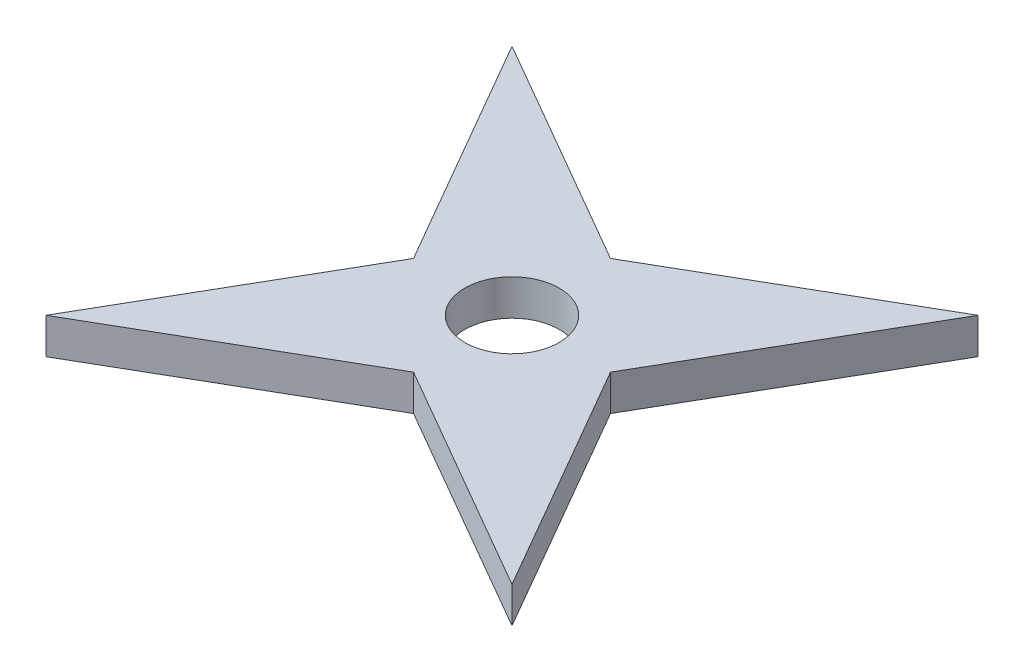
ISO-10303-21;
HEADER;
FILE_DESCRIPTION(('STEP AP214'),'2;1');
FILE_NAME('part.step','',(''),(''),'','','');
FILE_SCHEMA(('AUTOMOTIVE_DESIGN { 1 0 10303 214 1 1 1 1 }'));
ENDSEC;
DATA;
#1=APPLICATION_CONTEXT('core data for automotive mechanical design processes');
#2=APPLICATION_PROTOCOL_DEFINITION('international standard','automotive_design',2000,#1);
#3=PRODUCT_CONTEXT('',#1,'mechanical');
#4=PRODUCT('Part','Part','',(#3));
#5=PRODUCT_RELATED_PRODUCT_CATEGORY('part','',(#4));
#6=PRODUCT_DEFINITION_FORMATION('','',#4);
#7=PRODUCT_DEFINITION_CONTEXT('part definition',#1,'design');
#8=PRODUCT_DEFINITION('design','',#6,#7);
#9=PRODUCT_DEFINITION_SHAPE('','',#8);
#10=(LENGTH_UNIT() NAMED_UNIT(*) SI_UNIT(.MILLI.,.METRE.));
#11=(NAMED_UNIT(*) PLANE_ANGLE_UNIT() SI_UNIT($,.RADIAN.));
#12=(NAMED_UNIT(*) SI_UNIT($,.STERADIAN.) SOLID_ANGLE_UNIT());
#13=UNCERTAINTY_MEASURE_WITH_UNIT(LENGTH_MEASURE(1.E-05),#10,'distance_accuracy_value','');
#14=(GEOMETRIC_REPRESENTATION_CONTEXT(3) GLOBAL_UNCERTAINTY_ASSIGNED_CONTEXT((#13)) GLOBAL_UNIT_ASSIGNED_CONTEXT((#10,
#11,#12)) REPRESENTATION_CONTEXT('',''));
#15=CARTESIAN_POINT('',(0.,0.,0.));
#16=DIRECTION('',(0.,0.,1.));
#17=DIRECTION('',(1.,0.,0.));
#18=AXIS2_PLACEMENT_3D('',#15,#16,#17);
#19=CARTESIAN_POINT('',(0.,10.,0.));
#20=DIRECTION('',(0.,1.,0.));
#21=DIRECTION('',(0.,0.,1.));
#22=AXIS2_PLACEMENT_3D('',#19,#20,#21);
#23=PLANE('',#22);
#24=DIRECTION('',(0.866025403784438,0.,-0.500000000000001));
#25=VECTOR('',#24,1.);
#26=CARTESIAN_POINT('',(0.,10.,0.));
#27=LINE('',#26,#25);
#28=CARTESIAN_POINT('',(0.,10.,0.));
#29=VERTEX_POINT('',#28);
#30=CARTESIAN_POINT('',(64.9519052838328,10.,-37.5000000000001));
#31=VERTEX_POINT('',#30);
#32=EDGE_CURVE('E149',#29,#31,#27,.T.);
#33=ORIENTED_EDGE('',*,*,#32,.T.);
#34=DIRECTION('',(0.866025403784438,0.,0.500000000000001));
#35=VECTOR('',#34,1.);
#36=CARTESIAN_POINT('',(129.903810567666,10.,0.));
#37=LINE('',#36,#35);
#38=CARTESIAN_POINT('',(129.903810567666,10.,0.));
#39=VERTEX_POINT('',#38);
#40=EDGE_CURVE('E97',#31,#39,#37,.T.);
#41=ORIENTED_EDGE('',*,*,#40,.T.);
#42=DIRECTION('',(-0.500000000000001,0.,-0.866025403784438));
#43=VECTOR('',#42,1.);
#44=CARTESIAN_POINT('',(129.903810567666,10.,0.));
#45=LINE('',#44,#43);
#46=CARTESIAN_POINT('',(92.4038105676656,10.,-64.9519052838328));
#47=VERTEX_POINT('',#46);
#48=EDGE_CURVE('E164',#39,#47,#45,.T.);
#49=ORIENTED_EDGE('',*,*,#48,.T.);
#50=DIRECTION('',(0.5,0.,-0.866025403784438));
#51=VECTOR('',#50,1.);
#52=CARTESIAN_POINT('',(129.903810567666,10.,-129.903810567666));
#53=LINE('',#52,#51);
#54=CARTESIAN_POINT('',(129.903810567666,10.,-129.903810567666));
#55=VERTEX_POINT('',#54);
#56=EDGE_CURVE('E177',#47,#55,#53,.T.);
#57=ORIENTED_EDGE('',*,*,#56,.T.);
#58=DIRECTION('',(-0.866025403784438,0.,0.500000000000001));
#59=VECTOR('',#58,1.);
#60=CARTESIAN_POINT('',(129.903810567666,10.,-129.903810567666));
#61=LINE('',#60,#59);
#62=CARTESIAN_POINT('',(64.9519052838328,10.,-92.4038105676656));
#63=VERTEX_POINT('',#62);
#64=EDGE_CURVE('E116',#55,#63,#61,.T.);
#65=ORIENTED_EDGE('',*,*,#64,.T.);
#66=DIRECTION('',(-0.866025403784438,0.,-0.500000000000001));
#67=VECTOR('',#66,1.);
#68=CARTESIAN_POINT('',(0.,10.,-129.903810567666));
#69=LINE('',#68,#67);
#70=CARTESIAN_POINT('',(0.,10.,-129.903810567666));
#71=VERTEX_POINT('',#70);
#72=EDGE_CURVE('E110',#63,#71,#69,.T.);
#73=ORIENTED_EDGE('',*,*,#72,.T.);
#74=DIRECTION('',(0.500000000000001,0.,0.866025403784438));
#75=VECTOR('',#74,1.);
#76=CARTESIAN_POINT('',(0.,10.,-129.903810567666));
#77=LINE('',#76,#75);
#78=CARTESIAN_POINT('',(37.5000000000001,10.,-64.9519052838328));
#79=VERTEX_POINT('',#78);
#80=EDGE_CURVE('E114',#71,#79,#77,.T.);
#81=ORIENTED_EDGE('',*,*,#80,.T.);
#82=DIRECTION('',(-0.500000000000001,0.,0.866025403784438));
#83=VECTOR('',#82,1.);
#84=CARTESIAN_POINT('',(0.,10.,0.));
#85=LINE('',#84,#83);
#86=EDGE_CURVE('E54',#79,#29,#85,.T.);
#87=ORIENTED_EDGE('',*,*,#86,.T.);
#88=EDGE_LOOP('',(#33,#41,#49,#57,#65,#73,#81,#87));
#89=FACE_BOUND('',#88,.T.);
#90=CARTESIAN_POINT('',(64.9519052838328,10.,-64.9519052838328));
#91=DIRECTION('',(0.,1.,0.));
#92=DIRECTION('',(0.,0.,1.));
#93=AXIS2_PLACEMENT_3D('',#90,#91,#92);
#94=CIRCLE('',#93,13.155);
#95=CARTESIAN_POINT('',(64.9519052838328,10.,-51.7969052838328));
#96=VERTEX_POINT('',#95);
#97=EDGE_CURVE('E138',#96,#96,#94,.T.);
#98=ORIENTED_EDGE('',*,*,#97,.F.);
#99=EDGE_LOOP('',(#98));
#100=FACE_BOUND('',#99,.T.);
#101=ADVANCED_FACE('F37',(#89,#100),#23,.T.);
#102=CARTESIAN_POINT('',(0.,0.,0.));
#103=DIRECTION('',(0.,1.,0.));
#104=DIRECTION('',(0.,0.,1.));
#105=AXIS2_PLACEMENT_3D('',#102,#103,#104);
#106=PLANE('',#105);
#107=DIRECTION('',(0.866025403784438,0.,-0.500000000000001));
#108=VECTOR('',#107,1.);
#109=CARTESIAN_POINT('',(0.,0.,0.));
#110=LINE('',#109,#108);
#111=CARTESIAN_POINT('',(0.,0.,0.));
#112=VERTEX_POINT('',#111);
#113=CARTESIAN_POINT('',(64.9519052838328,0.,-37.5000000000001));
#114=VERTEX_POINT('',#113);
#115=EDGE_CURVE('E134',#112,#114,#110,.T.);
#116=ORIENTED_EDGE('',*,*,#115,.F.);
#117=DIRECTION('',(-0.500000000000001,0.,0.866025403784438));
#118=VECTOR('',#117,1.);
#119=CARTESIAN_POINT('',(0.,0.,0.));
#120=LINE('',#119,#118);
#121=CARTESIAN_POINT('',(37.5000000000001,0.,-64.9519052838328));
#122=VERTEX_POINT('',#121);
#123=EDGE_CURVE('E89',#122,#112,#120,.T.);
#124=ORIENTED_EDGE('',*,*,#123,.F.);
#125=DIRECTION('',(0.500000000000001,0.,0.866025403784438));
#126=VECTOR('',#125,1.);
#127=CARTESIAN_POINT('',(0.,0.,-129.903810567666));
#128=LINE('',#127,#126);
#129=CARTESIAN_POINT('',(0.,0.,-129.903810567666));
#130=VERTEX_POINT('',#129);
#131=EDGE_CURVE('E83',#130,#122,#128,.T.);
#132=ORIENTED_EDGE('',*,*,#131,.F.);
#133=DIRECTION('',(-0.866025403784438,0.,-0.500000000000001));
#134=VECTOR('',#133,1.);
#135=CARTESIAN_POINT('',(0.,0.,-129.903810567666));
#136=LINE('',#135,#134);
#137=CARTESIAN_POINT('',(64.9519052838328,0.,-92.4038105676656));
#138=VERTEX_POINT('',#137);
#139=EDGE_CURVE('E124',#138,#130,#136,.T.);
#140=ORIENTED_EDGE('',*,*,#139,.F.);
#141=DIRECTION('',(-0.866025403784438,0.,0.500000000000001));
#142=VECTOR('',#141,1.);
#143=CARTESIAN_POINT('',(129.903810567666,0.,-129.903810567666));
#144=LINE('',#143,#142);
#145=CARTESIAN_POINT('',(129.903810567666,0.,-129.903810567666));
#146=VERTEX_POINT('',#145);
#147=EDGE_CURVE('E144',#146,#138,#144,.T.);
#148=ORIENTED_EDGE('',*,*,#147,.F.);
#149=DIRECTION('',(0.5,0.,-0.866025403784438));
#150=VECTOR('',#149,1.);
#151=CARTESIAN_POINT('',(129.903810567666,0.,-129.903810567666));
#152=LINE('',#151,#150);
#153=CARTESIAN_POINT('',(92.4038105676656,0.,-64.9519052838328));
#154=VERTEX_POINT('',#153);
#155=EDGE_CURVE('E142',#154,#146,#152,.T.);
#156=ORIENTED_EDGE('',*,*,#155,.F.);
#157=DIRECTION('',(-0.500000000000001,0.,-0.866025403784438));
#158=VECTOR('',#157,1.);
#159=CARTESIAN_POINT('',(129.903810567666,0.,0.));
#160=LINE('',#159,#158);
#161=CARTESIAN_POINT('',(129.903810567666,0.,0.));
#162=VERTEX_POINT('',#161);
#163=EDGE_CURVE('E140',#162,#154,#160,.T.);
#164=ORIENTED_EDGE('',*,*,#163,.F.);
#165=DIRECTION('',(0.866025403784438,0.,0.500000000000001));
#166=VECTOR('',#165,1.);
#167=CARTESIAN_POINT('',(129.903810567666,0.,0.));
#168=LINE('',#167,#166);
#169=EDGE_CURVE('E137',#114,#162,#168,.T.);
#170=ORIENTED_EDGE('',*,*,#169,.F.);
#171=EDGE_LOOP('',(#116,#124,#132,#140,#148,#156,#164,#170));
#172=FACE_BOUND('',#171,.T.);
#173=CARTESIAN_POINT('',(64.9519052838328,0.,-64.9519052838328));
#174=DIRECTION('',(0.,1.,0.));
#175=DIRECTION('',(0.,0.,1.));
#176=AXIS2_PLACEMENT_3D('',#173,#174,#175);
#177=CIRCLE('',#176,13.155);
#178=CARTESIAN_POINT('',(64.9519052838328,0.,-51.7969052838328));
#179=VERTEX_POINT('',#178);
#180=EDGE_CURVE('E183',#179,#179,#177,.T.);
#181=ORIENTED_EDGE('',*,*,#180,.T.);
#182=EDGE_LOOP('',(#181));
#183=FACE_BOUND('',#182,.T.);
#184=ADVANCED_FACE('F168',(#172,#183),#106,.F.);
#185=CARTESIAN_POINT('',(0.,10.,0.));
#186=DIRECTION('',(-0.500000000000001,0.,-0.866025403784438));
#187=DIRECTION('',(-0.866025403784438,0.,0.500000000000001));
#188=AXIS2_PLACEMENT_3D('',#185,#186,#187);
#189=PLANE('',#188);
#190=ORIENTED_EDGE('',*,*,#115,.T.);
#191=DIRECTION('',(0.,-1.,0.));
#192=VECTOR('',#191,1.);
#193=CARTESIAN_POINT('',(64.9519052838328,10.,-37.5000000000001));
#194=LINE('',#193,#192);
#195=EDGE_CURVE('E11',#31,#114,#194,.T.);
#196=ORIENTED_EDGE('',*,*,#195,.F.);
#197=ORIENTED_EDGE('',*,*,#32,.F.);
#198=DIRECTION('',(0.,-1.,0.));
#199=VECTOR('',#198,1.);
#200=CARTESIAN_POINT('',(0.,10.,0.));
#201=LINE('',#200,#199);
#202=EDGE_CURVE('E130',#29,#112,#201,.T.);
#203=ORIENTED_EDGE('',*,*,#202,.T.);
#204=EDGE_LOOP('',(#190,#196,#197,#203));
#205=FACE_BOUND('',#204,.T.);
#206=ADVANCED_FACE('F39',(#205),#189,.F.);
#207=CARTESIAN_POINT('',(129.903810567666,10.,0.));
#208=DIRECTION('',(0.500000000000001,0.,-0.866025403784438));
#209=DIRECTION('',(-0.866025403784438,0.,-0.500000000000001));
#210=AXIS2_PLACEMENT_3D('',#207,#208,#209);
#211=PLANE('',#210);
#212=ORIENTED_EDGE('',*,*,#169,.T.);
#213=DIRECTION('',(0.,-1.,0.));
#214=VECTOR('',#213,1.);
#215=CARTESIAN_POINT('',(129.903810567666,10.,0.));
#216=LINE('',#215,#214);
#217=EDGE_CURVE('E46',#39,#162,#216,.T.);
#218=ORIENTED_EDGE('',*,*,#217,.F.);
#219=ORIENTED_EDGE('',*,*,#40,.F.);
#220=ORIENTED_EDGE('',*,*,#195,.T.);
#221=EDGE_LOOP('',(#212,#218,#219,#220));
#222=FACE_BOUND('',#221,.T.);
#223=ADVANCED_FACE('F211',(#222),#211,.F.);
#224=CARTESIAN_POINT('',(129.903810567666,10.,0.));
#225=DIRECTION('',(-0.866025403784438,0.,0.500000000000001));
#226=DIRECTION('',(0.500000000000001,0.,0.866025403784438));
#227=AXIS2_PLACEMENT_3D('',#224,#225,#226);
#228=PLANE('',#227);
#229=ORIENTED_EDGE('',*,*,#163,.T.);
#230=DIRECTION('',(0.,-1.,0.));
#231=VECTOR('',#230,1.);
#232=CARTESIAN_POINT('',(92.4038105676656,10.,-64.9519052838328));
#233=LINE('',#232,#231);
#234=EDGE_CURVE('E156',#47,#154,#233,.T.);
#235=ORIENTED_EDGE('',*,*,#234,.F.);
#236=ORIENTED_EDGE('',*,*,#48,.F.);
#237=ORIENTED_EDGE('',*,*,#217,.T.);
#238=EDGE_LOOP('',(#229,#235,#236,#237));
#239=FACE_BOUND('',#238,.T.);
#240=ADVANCED_FACE('F162',(#239),#228,.F.);
#241=CARTESIAN_POINT('',(129.903810567666,10.,-129.903810567666));
#242=DIRECTION('',(-0.866025403784438,0.,-0.5));
#243=DIRECTION('',(-0.5,0.,0.866025403784438));
#244=AXIS2_PLACEMENT_3D('',#241,#242,#243);
#245=PLANE('',#244);
#246=ORIENTED_EDGE('',*,*,#155,.T.);
#247=DIRECTION('',(0.,-1.,0.));
#248=VECTOR('',#247,1.);
#249=CARTESIAN_POINT('',(129.903810567666,10.,-129.903810567666));
#250=LINE('',#249,#248);
#251=EDGE_CURVE('E153',#55,#146,#250,.T.);
#252=ORIENTED_EDGE('',*,*,#251,.F.);
#253=ORIENTED_EDGE('',*,*,#56,.F.);
#254=ORIENTED_EDGE('',*,*,#234,.T.);
#255=EDGE_LOOP('',(#246,#252,#253,#254));
#256=FACE_BOUND('',#255,.T.);
#257=ADVANCED_FACE('F173',(#256),#245,.F.);
#258=CARTESIAN_POINT('',(129.903810567666,10.,-129.903810567666));
#259=DIRECTION('',(0.500000000000001,0.,0.866025403784438));
#260=DIRECTION('',(0.866025403784438,0.,-0.500000000000001));
#261=AXIS2_PLACEMENT_3D('',#258,#259,#260);
#262=PLANE('',#261);
#263=ORIENTED_EDGE('',*,*,#147,.T.);
#264=DIRECTION('',(0.,-1.,0.));
#265=VECTOR('',#264,1.);
#266=CARTESIAN_POINT('',(64.9519052838328,10.,-92.4038105676656));
#267=LINE('',#266,#265);
#268=EDGE_CURVE('E125',#63,#138,#267,.T.);
#269=ORIENTED_EDGE('',*,*,#268,.F.);
#270=ORIENTED_EDGE('',*,*,#64,.F.);
#271=ORIENTED_EDGE('',*,*,#251,.T.);
#272=EDGE_LOOP('',(#263,#269,#270,#271));
#273=FACE_BOUND('',#272,.T.);
#274=ADVANCED_FACE('F176',(#273),#262,.F.);
#275=CARTESIAN_POINT('',(0.,10.,-129.903810567666));
#276=DIRECTION('',(-0.500000000000001,0.,0.866025403784438));
#277=DIRECTION('',(0.866025403784438,0.,0.500000000000001));
#278=AXIS2_PLACEMENT_3D('',#275,#276,#277);
#279=PLANE('',#278);
#280=ORIENTED_EDGE('',*,*,#139,.T.);
#281=DIRECTION('',(0.,-1.,0.));
#282=VECTOR('',#281,1.);
#283=CARTESIAN_POINT('',(0.,10.,-129.903810567666));
#284=LINE('',#283,#282);
#285=EDGE_CURVE('E121',#71,#130,#284,.T.);
#286=ORIENTED_EDGE('',*,*,#285,.F.);
#287=ORIENTED_EDGE('',*,*,#72,.F.);
#288=ORIENTED_EDGE('',*,*,#268,.T.);
#289=EDGE_LOOP('',(#280,#286,#287,#288));
#290=FACE_BOUND('',#289,.T.);
#291=ADVANCED_FACE('F122',(#290),#279,.F.);
#292=CARTESIAN_POINT('',(0.,10.,-129.903810567666));
#293=DIRECTION('',(0.866025403784438,0.,-0.500000000000001));
#294=DIRECTION('',(-0.500000000000001,0.,-0.866025403784438));
#295=AXIS2_PLACEMENT_3D('',#292,#293,#294);
#296=PLANE('',#295);
#297=ORIENTED_EDGE('',*,*,#131,.T.);
#298=DIRECTION('',(0.,-1.,0.));
#299=VECTOR('',#298,1.);
#300=CARTESIAN_POINT('',(37.5000000000001,10.,-64.9519052838328));
#301=LINE('',#300,#299);
#302=EDGE_CURVE('E126',#79,#122,#301,.T.);
#303=ORIENTED_EDGE('',*,*,#302,.F.);
#304=ORIENTED_EDGE('',*,*,#80,.F.);
#305=ORIENTED_EDGE('',*,*,#285,.T.);
#306=EDGE_LOOP('',(#297,#303,#304,#305));
#307=FACE_BOUND('',#306,.T.);
#308=ADVANCED_FACE('F128',(#307),#296,.F.);
#309=CARTESIAN_POINT('',(0.,10.,0.));
#310=DIRECTION('',(0.866025403784438,0.,0.500000000000001));
#311=DIRECTION('',(0.500000000000001,0.,-0.866025403784438));
#312=AXIS2_PLACEMENT_3D('',#309,#310,#311);
#313=PLANE('',#312);
#314=ORIENTED_EDGE('',*,*,#123,.T.);
#315=ORIENTED_EDGE('',*,*,#202,.F.);
#316=ORIENTED_EDGE('',*,*,#86,.F.);
#317=ORIENTED_EDGE('',*,*,#302,.T.);
#318=EDGE_LOOP('',(#314,#315,#316,#317));
#319=FACE_BOUND('',#318,.T.);
#320=ADVANCED_FACE('F199',(#319),#313,.F.);
#321=CARTESIAN_POINT('',(64.9519052838328,10.,-64.9519052838328));
#322=DIRECTION('',(0.,-1.,0.));
#323=DIRECTION('',(0.,0.,-1.));
#324=AXIS2_PLACEMENT_3D('',#321,#322,#323);
#325=CYLINDRICAL_SURFACE('',#324,13.155);
#326=ORIENTED_EDGE('',*,*,#97,.T.);
#327=EDGE_LOOP('',(#326));
#328=FACE_BOUND('',#327,.T.);
#329=ORIENTED_EDGE('',*,*,#180,.F.);
#330=EDGE_LOOP('',(#329));
#331=FACE_BOUND('',#330,.T.);
#332=ADVANCED_FACE('F189',(#328,#331),#325,.F.);
#333=CLOSED_SHELL('',(#101,#184,#206,#223,#240,#257,#274,#291,#308,#320,#332));
#334=MANIFOLD_SOLID_BREP('B2',#333);
#335=ADVANCED_BREP_SHAPE_REPRESENTATION('',(#18,#334),#14);
#336=SHAPE_DEFINITION_REPRESENTATION(#9,#335);
ENDSEC;
END-ISO-10303-21;
